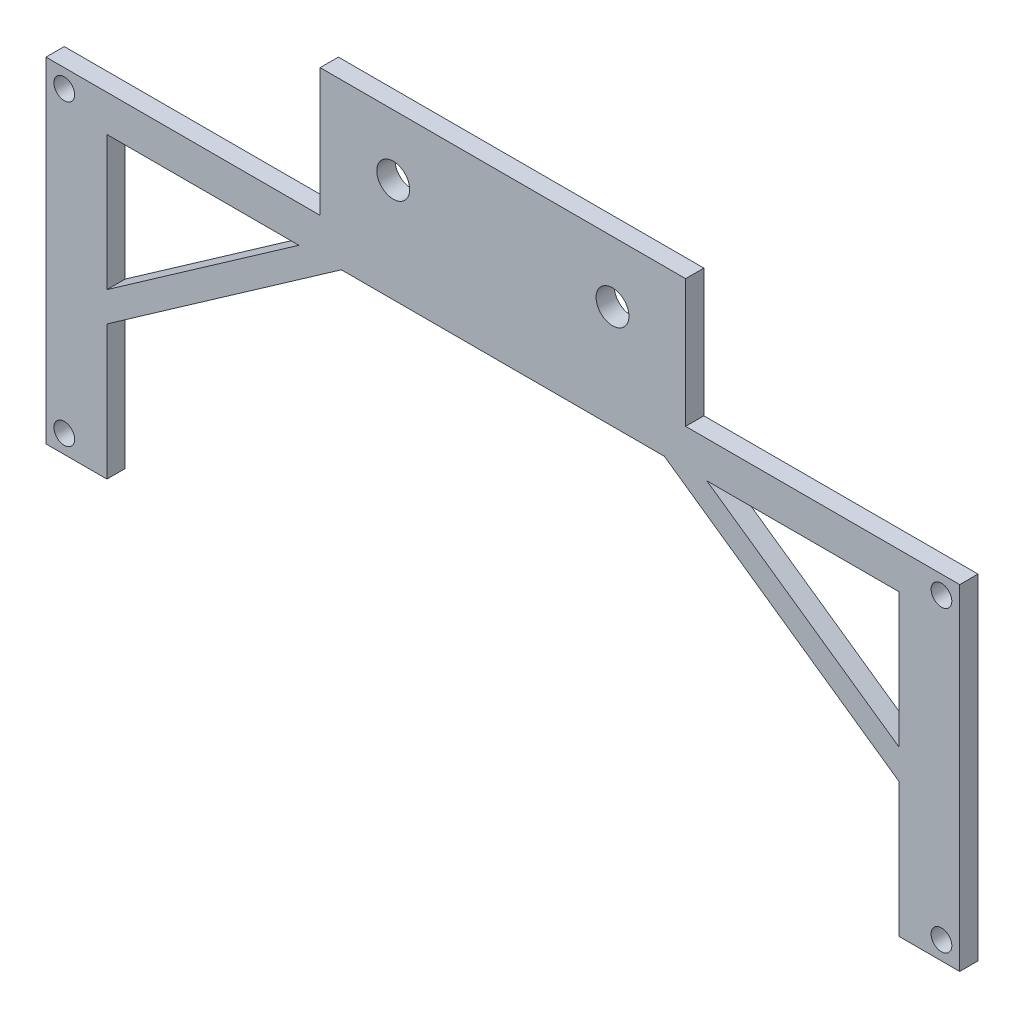
ISO-10303-21;
HEADER;
FILE_DESCRIPTION(('STEP AP214'),'2;1');
FILE_NAME('part.step','',(''),(''),'','','');
FILE_SCHEMA(('AUTOMOTIVE_DESIGN { 1 0 10303 214 1 1 1 1 }'));
ENDSEC;
DATA;
#1=APPLICATION_CONTEXT('core data for automotive mechanical design processes');
#2=APPLICATION_PROTOCOL_DEFINITION('international standard','automotive_design',2000,#1);
#3=PRODUCT_CONTEXT('',#1,'mechanical');
#4=PRODUCT('Part','Part','',(#3));
#5=PRODUCT_RELATED_PRODUCT_CATEGORY('part','',(#4));
#6=PRODUCT_DEFINITION_FORMATION('','',#4);
#7=PRODUCT_DEFINITION_CONTEXT('part definition',#1,'design');
#8=PRODUCT_DEFINITION('design','',#6,#7);
#9=PRODUCT_DEFINITION_SHAPE('','',#8);
#10=(LENGTH_UNIT() NAMED_UNIT(*) SI_UNIT(.MILLI.,.METRE.));
#11=(NAMED_UNIT(*) PLANE_ANGLE_UNIT() SI_UNIT($,.RADIAN.));
#12=(NAMED_UNIT(*) SI_UNIT($,.STERADIAN.) SOLID_ANGLE_UNIT());
#13=UNCERTAINTY_MEASURE_WITH_UNIT(LENGTH_MEASURE(1.E-05),#10,'distance_accuracy_value','');
#14=(GEOMETRIC_REPRESENTATION_CONTEXT(3) GLOBAL_UNCERTAINTY_ASSIGNED_CONTEXT((#13)) GLOBAL_UNIT_ASSIGNED_CONTEXT((#10,
#11,#12)) REPRESENTATION_CONTEXT('',''));
#15=CARTESIAN_POINT('',(0.,0.,0.));
#16=DIRECTION('',(0.,0.,1.));
#17=DIRECTION('',(1.,0.,0.));
#18=AXIS2_PLACEMENT_3D('',#15,#16,#17);
#19=CARTESIAN_POINT('',(-30.,-13.5,3.));
#20=DIRECTION('',(0.,1.,0.));
#21=DIRECTION('',(-1.,0.,0.));
#22=AXIS2_PLACEMENT_3D('',#19,#20,#21);
#23=PLANE('',#22);
#24=DIRECTION('',(1.,0.,0.));
#25=VECTOR('',#24,1.);
#26=CARTESIAN_POINT('',(-30.,-13.5,0.));
#27=LINE('',#26,#25);
#28=CARTESIAN_POINT('',(-26.5124126812189,-13.5,0.));
#29=VERTEX_POINT('',#28);
#30=CARTESIAN_POINT('',(26.5124126812189,-13.5,0.));
#31=VERTEX_POINT('',#30);
#32=EDGE_CURVE('E267',#29,#31,#27,.T.);
#33=ORIENTED_EDGE('',*,*,#32,.T.);
#34=DIRECTION('',(0.,0.,1.));
#35=VECTOR('',#34,1.);
#36=CARTESIAN_POINT('',(26.5124126812189,-13.5,-46.9800875122108));
#37=LINE('',#36,#35);
#38=CARTESIAN_POINT('',(26.5124126812189,-13.5,3.));
#39=VERTEX_POINT('',#38);
#40=EDGE_CURVE('E56',#31,#39,#37,.T.);
#41=ORIENTED_EDGE('',*,*,#40,.T.);
#42=DIRECTION('',(1.,0.,0.));
#43=VECTOR('',#42,1.);
#44=CARTESIAN_POINT('',(-30.,-13.5,3.));
#45=LINE('',#44,#43);
#46=CARTESIAN_POINT('',(-26.512412681219,-13.5,3.));
#47=VERTEX_POINT('',#46);
#48=EDGE_CURVE('E258',#47,#39,#45,.T.);
#49=ORIENTED_EDGE('',*,*,#48,.F.);
#50=DIRECTION('',(0.,0.,1.));
#51=VECTOR('',#50,1.);
#52=CARTESIAN_POINT('',(-26.5124126812189,-13.5,-46.9800875122108));
#53=LINE('',#52,#51);
#54=EDGE_CURVE('E467',#29,#47,#53,.T.);
#55=ORIENTED_EDGE('',*,*,#54,.F.);
#56=EDGE_LOOP('',(#33,#41,#49,#55));
#57=FACE_BOUND('',#56,.T.);
#58=ADVANCED_FACE('F33',(#57),#23,.F.);
#59=CARTESIAN_POINT('',(65.,-13.5,-159.765453086705));
#60=DIRECTION('',(-1.,0.,0.));
#61=DIRECTION('',(0.,-1.,0.));
#62=AXIS2_PLACEMENT_3D('',#59,#60,#61);
#63=PLANE('',#62);
#64=DIRECTION('',(0.,0.,1.));
#65=VECTOR('',#64,1.);
#66=CARTESIAN_POINT('',(65.,-40.4413111231467,-46.9800875122108));
#67=LINE('',#66,#65);
#68=CARTESIAN_POINT('',(65.,-40.4413111231467,0.));
#69=VERTEX_POINT('',#68);
#70=CARTESIAN_POINT('',(65.,-40.4413111231467,3.));
#71=VERTEX_POINT('',#70);
#72=EDGE_CURVE('E445',#69,#71,#67,.T.);
#73=ORIENTED_EDGE('',*,*,#72,.F.);
#74=DIRECTION('',(0.,1.,0.));
#75=VECTOR('',#74,1.);
#76=CARTESIAN_POINT('',(65.,-13.5,0.));
#77=LINE('',#76,#75);
#78=CARTESIAN_POINT('',(65.,-62.4999999999999,0.));
#79=VERTEX_POINT('',#78);
#80=EDGE_CURVE('E317',#79,#69,#77,.T.);
#81=ORIENTED_EDGE('',*,*,#80,.F.);
#82=DIRECTION('',(0.,0.,1.));
#83=VECTOR('',#82,1.);
#84=CARTESIAN_POINT('',(65.,-62.4999999999999,-159.765453086705));
#85=LINE('',#84,#83);
#86=CARTESIAN_POINT('',(65.,-62.4999999999999,3.));
#87=VERTEX_POINT('',#86);
#88=EDGE_CURVE('E206',#79,#87,#85,.T.);
#89=ORIENTED_EDGE('',*,*,#88,.T.);
#90=DIRECTION('',(0.,-1.,0.));
#91=VECTOR('',#90,1.);
#92=CARTESIAN_POINT('',(65.,-13.5,3.));
#93=LINE('',#92,#91);
#94=EDGE_CURVE('E193',#71,#87,#93,.T.);
#95=ORIENTED_EDGE('',*,*,#94,.F.);
#96=EDGE_LOOP('',(#73,#81,#89,#95));
#97=FACE_BOUND('',#96,.T.);
#98=ADVANCED_FACE('F365',(#97),#63,.T.);
#99=CARTESIAN_POINT('',(-65.,-13.5,0.));
#100=VERTEX_POINT('',#99);
#101=CARTESIAN_POINT('',(-33.4875873187811,-13.5,0.));
#102=VERTEX_POINT('',#101);
#103=EDGE_CURVE('E264',#100,#102,#27,.T.);
#104=ORIENTED_EDGE('',*,*,#103,.T.);
#105=DIRECTION('',(0.,0.,1.));
#106=VECTOR('',#105,1.);
#107=CARTESIAN_POINT('',(-33.4875873187811,-13.5,-46.9800875122108));
#108=LINE('',#107,#106);
#109=CARTESIAN_POINT('',(-33.4875873187811,-13.5,3.));
#110=VERTEX_POINT('',#109);
#111=EDGE_CURVE('E465',#102,#110,#108,.T.);
#112=ORIENTED_EDGE('',*,*,#111,.T.);
#113=CARTESIAN_POINT('',(-65.,-13.5,3.));
#114=VERTEX_POINT('',#113);
#115=EDGE_CURVE('E254',#114,#110,#45,.T.);
#116=ORIENTED_EDGE('',*,*,#115,.F.);
#117=DIRECTION('',(0.,0.,1.));
#118=VECTOR('',#117,1.);
#119=CARTESIAN_POINT('',(-65.,-13.5,-159.765453086705));
#120=LINE('',#119,#118);
#121=EDGE_CURVE('E211',#100,#114,#120,.T.);
#122=ORIENTED_EDGE('',*,*,#121,.F.);
#123=EDGE_LOOP('',(#104,#112,#116,#122));
#124=FACE_BOUND('',#123,.T.);
#125=ADVANCED_FACE('F366',(#124),#23,.F.);
#126=CARTESIAN_POINT('',(-65.,-13.5,-159.765453086705));
#127=DIRECTION('',(1.,0.,0.));
#128=DIRECTION('',(0.,0.,-1.));
#129=AXIS2_PLACEMENT_3D('',#126,#127,#128);
#130=PLANE('',#129);
#131=DIRECTION('',(0.,0.,1.));
#132=VECTOR('',#131,1.);
#133=CARTESIAN_POINT('',(-65.,-35.5586888768532,-46.9800875122108));
#134=LINE('',#133,#132);
#135=CARTESIAN_POINT('',(-65.,-35.5586888768532,0.));
#136=VERTEX_POINT('',#135);
#137=CARTESIAN_POINT('',(-65.,-35.5586888768532,3.));
#138=VERTEX_POINT('',#137);
#139=EDGE_CURVE('E456',#136,#138,#134,.T.);
#140=ORIENTED_EDGE('',*,*,#139,.F.);
#141=DIRECTION('',(0.,-1.,0.));
#142=VECTOR('',#141,1.);
#143=CARTESIAN_POINT('',(-65.,-13.5,0.));
#144=LINE('',#143,#142);
#145=EDGE_CURVE('E334',#100,#136,#144,.T.);
#146=ORIENTED_EDGE('',*,*,#145,.F.);
#147=ORIENTED_EDGE('',*,*,#121,.T.);
#148=DIRECTION('',(0.,1.,0.));
#149=VECTOR('',#148,1.);
#150=CARTESIAN_POINT('',(-65.,-13.5,3.));
#151=LINE('',#150,#149);
#152=EDGE_CURVE('E321',#138,#114,#151,.T.);
#153=ORIENTED_EDGE('',*,*,#152,.F.);
#154=EDGE_LOOP('',(#140,#146,#147,#153));
#155=FACE_BOUND('',#154,.T.);
#156=ADVANCED_FACE('F362',(#155),#130,.T.);
#157=CARTESIAN_POINT('',(-30.,13.5,3.));
#158=DIRECTION('',(1.,0.,0.));
#159=DIRECTION('',(0.,0.,-1.));
#160=AXIS2_PLACEMENT_3D('',#157,#158,#159);
#161=PLANE('',#160);
#162=DIRECTION('',(0.,-1.,0.));
#163=VECTOR('',#162,1.);
#164=CARTESIAN_POINT('',(-30.,13.5,0.));
#165=LINE('',#164,#163);
#166=CARTESIAN_POINT('',(-30.,13.5,0.));
#167=VERTEX_POINT('',#166);
#168=CARTESIAN_POINT('',(-30.,-7.49999999999997,0.));
#169=VERTEX_POINT('',#168);
#170=EDGE_CURVE('E249',#167,#169,#165,.T.);
#171=ORIENTED_EDGE('',*,*,#170,.T.);
#172=DIRECTION('',(0.,0.,1.));
#173=VECTOR('',#172,1.);
#174=CARTESIAN_POINT('',(-30.,-7.49999999999996,3.));
#175=LINE('',#174,#173);
#176=CARTESIAN_POINT('',(-30.,-7.49999999999997,3.));
#177=VERTEX_POINT('',#176);
#178=EDGE_CURVE('E247',#169,#177,#175,.T.);
#179=ORIENTED_EDGE('',*,*,#178,.T.);
#180=DIRECTION('',(0.,-1.,0.));
#181=VECTOR('',#180,1.);
#182=CARTESIAN_POINT('',(-30.,13.5,3.));
#183=LINE('',#182,#181);
#184=CARTESIAN_POINT('',(-30.,13.5,3.));
#185=VERTEX_POINT('',#184);
#186=EDGE_CURVE('E250',#185,#177,#183,.T.);
#187=ORIENTED_EDGE('',*,*,#186,.F.);
#188=DIRECTION('',(0.,0.,-1.));
#189=VECTOR('',#188,1.);
#190=CARTESIAN_POINT('',(-30.,13.5,3.));
#191=LINE('',#190,#189);
#192=EDGE_CURVE('E41',#185,#167,#191,.T.);
#193=ORIENTED_EDGE('',*,*,#192,.T.);
#194=EDGE_LOOP('',(#171,#179,#187,#193));
#195=FACE_BOUND('',#194,.T.);
#196=ADVANCED_FACE('F35',(#195),#161,.F.);
#197=CARTESIAN_POINT('',(33.487587318781,-13.5,3.));
#198=VERTEX_POINT('',#197);
#199=CARTESIAN_POINT('',(65.,-13.5,3.));
#200=VERTEX_POINT('',#199);
#201=EDGE_CURVE('E48',#198,#200,#45,.T.);
#202=ORIENTED_EDGE('',*,*,#201,.F.);
#203=DIRECTION('',(0.,0.,1.));
#204=VECTOR('',#203,1.);
#205=CARTESIAN_POINT('',(33.4875873187811,-13.5,-46.9800875122108));
#206=LINE('',#205,#204);
#207=CARTESIAN_POINT('',(33.4875873187811,-13.5,0.));
#208=VERTEX_POINT('',#207);
#209=EDGE_CURVE('E176',#208,#198,#206,.T.);
#210=ORIENTED_EDGE('',*,*,#209,.F.);
#211=CARTESIAN_POINT('',(65.,-13.5,0.));
#212=VERTEX_POINT('',#211);
#213=EDGE_CURVE('E263',#208,#212,#27,.T.);
#214=ORIENTED_EDGE('',*,*,#213,.T.);
#215=DIRECTION('',(0.,0.,1.));
#216=VECTOR('',#215,1.);
#217=CARTESIAN_POINT('',(65.,-13.5,-159.765453086705));
#218=LINE('',#217,#216);
#219=EDGE_CURVE('E209',#212,#200,#218,.T.);
#220=ORIENTED_EDGE('',*,*,#219,.T.);
#221=EDGE_LOOP('',(#202,#210,#214,#220));
#222=FACE_BOUND('',#221,.T.);
#223=ADVANCED_FACE('F367',(#222),#23,.F.);
#224=CARTESIAN_POINT('',(30.,13.5,3.));
#225=DIRECTION('',(-1.,0.,0.));
#226=DIRECTION('',(0.,0.,1.));
#227=AXIS2_PLACEMENT_3D('',#224,#225,#226);
#228=PLANE('',#227);
#229=DIRECTION('',(0.,1.,0.));
#230=VECTOR('',#229,1.);
#231=CARTESIAN_POINT('',(30.,13.5,3.));
#232=LINE('',#231,#230);
#233=CARTESIAN_POINT('',(30.,-7.49999999999997,3.));
#234=VERTEX_POINT('',#233);
#235=CARTESIAN_POINT('',(30.,13.5,3.));
#236=VERTEX_POINT('',#235);
#237=EDGE_CURVE('E257',#234,#236,#232,.T.);
#238=ORIENTED_EDGE('',*,*,#237,.F.);
#239=DIRECTION('',(0.,0.,-1.));
#240=VECTOR('',#239,1.);
#241=CARTESIAN_POINT('',(30.,-7.49999999999998,3.));
#242=LINE('',#241,#240);
#243=CARTESIAN_POINT('',(30.,-7.49999999999998,0.));
#244=VERTEX_POINT('',#243);
#245=EDGE_CURVE('E232',#234,#244,#242,.T.);
#246=ORIENTED_EDGE('',*,*,#245,.T.);
#247=DIRECTION('',(0.,1.,0.));
#248=VECTOR('',#247,1.);
#249=CARTESIAN_POINT('',(30.,13.5,0.));
#250=LINE('',#249,#248);
#251=CARTESIAN_POINT('',(30.,13.5,0.));
#252=VERTEX_POINT('',#251);
#253=EDGE_CURVE('E266',#244,#252,#250,.T.);
#254=ORIENTED_EDGE('',*,*,#253,.T.);
#255=DIRECTION('',(0.,0.,-1.));
#256=VECTOR('',#255,1.);
#257=CARTESIAN_POINT('',(30.,13.5,3.));
#258=LINE('',#257,#256);
#259=EDGE_CURVE('E11',#236,#252,#258,.T.);
#260=ORIENTED_EDGE('',*,*,#259,.F.);
#261=EDGE_LOOP('',(#238,#246,#254,#260));
#262=FACE_BOUND('',#261,.T.);
#263=ADVANCED_FACE('F299',(#262),#228,.F.);
#264=CARTESIAN_POINT('',(-30.,13.5,3.));
#265=DIRECTION('',(0.,-1.,0.));
#266=DIRECTION('',(0.,0.,-1.));
#267=AXIS2_PLACEMENT_3D('',#264,#265,#266);
#268=PLANE('',#267);
#269=DIRECTION('',(-1.,0.,0.));
#270=VECTOR('',#269,1.);
#271=CARTESIAN_POINT('',(-30.,13.5,0.));
#272=LINE('',#271,#270);
#273=EDGE_CURVE('E253',#252,#167,#272,.T.);
#274=ORIENTED_EDGE('',*,*,#273,.T.);
#275=ORIENTED_EDGE('',*,*,#192,.F.);
#276=DIRECTION('',(-1.,0.,0.));
#277=VECTOR('',#276,1.);
#278=CARTESIAN_POINT('',(-30.,13.5,3.));
#279=LINE('',#278,#277);
#280=EDGE_CURVE('E260',#236,#185,#279,.T.);
#281=ORIENTED_EDGE('',*,*,#280,.F.);
#282=ORIENTED_EDGE('',*,*,#259,.T.);
#283=EDGE_LOOP('',(#274,#275,#281,#282));
#284=FACE_BOUND('',#283,.T.);
#285=ADVANCED_FACE('F297',(#284),#268,.F.);
#286=CARTESIAN_POINT('',(0.,0.,3.));
#287=DIRECTION('',(0.,0.,1.));
#288=DIRECTION('',(1.,0.,0.));
#289=AXIS2_PLACEMENT_3D('',#286,#287,#288);
#290=PLANE('',#289);
#291=CARTESIAN_POINT('',(18.,3.49999999999998,3.));
#292=DIRECTION('',(0.,0.,1.));
#293=DIRECTION('',(-1.,0.,0.));
#294=AXIS2_PLACEMENT_3D('',#291,#292,#293);
#295=CIRCLE('',#294,2.7);
#296=CARTESIAN_POINT('',(15.3,3.49999999999998,3.));
#297=VERTEX_POINT('',#296);
#298=EDGE_CURVE('E432',#297,#297,#295,.T.);
#299=ORIENTED_EDGE('',*,*,#298,.F.);
#300=EDGE_LOOP('',(#299));
#301=FACE_BOUND('',#300,.T.);
#302=CARTESIAN_POINT('',(-18.,3.5,3.));
#303=DIRECTION('',(0.,0.,1.));
#304=DIRECTION('',(1.,0.,0.));
#305=AXIS2_PLACEMENT_3D('',#302,#303,#304);
#306=CIRCLE('',#305,2.7);
#307=CARTESIAN_POINT('',(-15.3,3.5,3.));
#308=VERTEX_POINT('',#307);
#309=EDGE_CURVE('E435',#308,#308,#306,.T.);
#310=ORIENTED_EDGE('',*,*,#309,.F.);
#311=EDGE_LOOP('',(#310));
#312=FACE_BOUND('',#311,.T.);
#313=ORIENTED_EDGE('',*,*,#48,.T.);
#314=DIRECTION('',(0.81923192051904,-0.573462344363329,0.));
#315=VECTOR('',#314,1.);
#316=CARTESIAN_POINT('',(63.8530753112734,-39.6384638410381,3.));
#317=LINE('',#316,#315);
#318=EDGE_CURVE('E179',#39,#71,#317,.T.);
#319=ORIENTED_EDGE('',*,*,#318,.T.);
#320=ORIENTED_EDGE('',*,*,#94,.T.);
#321=DIRECTION('',(1.,0.,0.));
#322=VECTOR('',#321,1.);
#323=CARTESIAN_POINT('',(65.,-62.4999999999999,3.));
#324=LINE('',#323,#322);
#325=CARTESIAN_POINT('',(75.,-62.4999999999999,3.));
#326=VERTEX_POINT('',#325);
#327=EDGE_CURVE('E192',#87,#326,#324,.T.);
#328=ORIENTED_EDGE('',*,*,#327,.T.);
#329=DIRECTION('',(0.,1.,0.));
#330=VECTOR('',#329,1.);
#331=CARTESIAN_POINT('',(75.,-7.5,3.));
#332=LINE('',#331,#330);
#333=CARTESIAN_POINT('',(75.,-7.5,3.));
#334=VERTEX_POINT('',#333);
#335=EDGE_CURVE('E234',#326,#334,#332,.T.);
#336=ORIENTED_EDGE('',*,*,#335,.T.);
#337=DIRECTION('',(-1.,0.,0.));
#338=VECTOR('',#337,1.);
#339=CARTESIAN_POINT('',(-75.,-7.49999999999995,3.));
#340=LINE('',#339,#338);
#341=EDGE_CURVE('E238',#334,#234,#340,.T.);
#342=ORIENTED_EDGE('',*,*,#341,.T.);
#343=ORIENTED_EDGE('',*,*,#237,.T.);
#344=ORIENTED_EDGE('',*,*,#280,.T.);
#345=ORIENTED_EDGE('',*,*,#186,.T.);
#346=CARTESIAN_POINT('',(-75.,-7.49999999999995,3.));
#347=VERTEX_POINT('',#346);
#348=EDGE_CURVE('E237',#177,#347,#340,.T.);
#349=ORIENTED_EDGE('',*,*,#348,.T.);
#350=DIRECTION('',(0.,-1.,0.));
#351=VECTOR('',#350,1.);
#352=CARTESIAN_POINT('',(-75.,-7.49999999999995,3.));
#353=LINE('',#352,#351);
#354=CARTESIAN_POINT('',(-75.,-62.4999999999999,3.));
#355=VERTEX_POINT('',#354);
#356=EDGE_CURVE('E221',#347,#355,#353,.T.);
#357=ORIENTED_EDGE('',*,*,#356,.T.);
#358=DIRECTION('',(1.,0.,0.));
#359=VECTOR('',#358,1.);
#360=CARTESIAN_POINT('',(-75.,-62.4999999999999,3.));
#361=LINE('',#360,#359);
#362=CARTESIAN_POINT('',(-65.,-62.4999999999999,3.));
#363=VERTEX_POINT('',#362);
#364=EDGE_CURVE('E295',#355,#363,#361,.T.);
#365=ORIENTED_EDGE('',*,*,#364,.T.);
#366=CARTESIAN_POINT('',(-65.,-40.4413111231467,3.));
#367=VERTEX_POINT('',#366);
#368=EDGE_CURVE('E198',#363,#367,#151,.T.);
#369=ORIENTED_EDGE('',*,*,#368,.T.);
#370=DIRECTION('',(0.819231920519041,0.573462344363328,0.));
#371=VECTOR('',#370,1.);
#372=CARTESIAN_POINT('',(-28.8530753112733,-15.1384638410381,3.));
#373=LINE('',#372,#371);
#374=EDGE_CURVE('E447',#367,#47,#373,.T.);
#375=ORIENTED_EDGE('',*,*,#374,.T.);
#376=EDGE_LOOP('',(#313,#319,#320,#328,#336,#342,#343,#344,#345,#349,#357,#365,#369,#375));
#377=FACE_BOUND('',#376,.T.);
#378=ORIENTED_EDGE('',*,*,#115,.T.);
#379=DIRECTION('',(-0.819231920519041,-0.573462344363328,0.));
#380=VECTOR('',#379,1.);
#381=CARTESIAN_POINT('',(-65.,-35.5586888768532,3.));
#382=LINE('',#381,#380);
#383=EDGE_CURVE('E460',#110,#138,#382,.T.);
#384=ORIENTED_EDGE('',*,*,#383,.T.);
#385=ORIENTED_EDGE('',*,*,#152,.T.);
#386=EDGE_LOOP('',(#378,#384,#385));
#387=FACE_BOUND('',#386,.T.);
#388=CARTESIAN_POINT('',(-72.,-59.4999999999999,3.));
#389=DIRECTION('',(0.,0.,1.));
#390=DIRECTION('',(-1.,0.,0.));
#391=AXIS2_PLACEMENT_3D('',#388,#389,#390);
#392=CIRCLE('',#391,1.7);
#393=CARTESIAN_POINT('',(-73.7,-59.4999999999999,3.));
#394=VERTEX_POINT('',#393);
#395=EDGE_CURVE('E473',#394,#394,#392,.T.);
#396=ORIENTED_EDGE('',*,*,#395,.F.);
#397=EDGE_LOOP('',(#396));
#398=FACE_BOUND('',#397,.T.);
#399=CARTESIAN_POINT('',(72.,-59.4999999999999,3.));
#400=DIRECTION('',(0.,0.,1.));
#401=DIRECTION('',(1.,0.,0.));
#402=AXIS2_PLACEMENT_3D('',#399,#400,#401);
#403=CIRCLE('',#402,1.7);
#404=CARTESIAN_POINT('',(73.7,-59.4999999999999,3.));
#405=VERTEX_POINT('',#404);
#406=EDGE_CURVE('E479',#405,#405,#403,.T.);
#407=ORIENTED_EDGE('',*,*,#406,.F.);
#408=EDGE_LOOP('',(#407));
#409=FACE_BOUND('',#408,.T.);
#410=CARTESIAN_POINT('',(72.,-10.5,3.));
#411=DIRECTION('',(0.,0.,1.));
#412=DIRECTION('',(-1.,0.,0.));
#413=AXIS2_PLACEMENT_3D('',#410,#411,#412);
#414=CIRCLE('',#413,1.7);
#415=CARTESIAN_POINT('',(70.3,-10.5,3.));
#416=VERTEX_POINT('',#415);
#417=EDGE_CURVE('E332',#416,#416,#414,.T.);
#418=ORIENTED_EDGE('',*,*,#417,.F.);
#419=EDGE_LOOP('',(#418));
#420=FACE_BOUND('',#419,.T.);
#421=CARTESIAN_POINT('',(-72.,-10.5,3.));
#422=DIRECTION('',(0.,0.,1.));
#423=DIRECTION('',(1.,0.,0.));
#424=AXIS2_PLACEMENT_3D('',#421,#422,#423);
#425=CIRCLE('',#424,1.7);
#426=CARTESIAN_POINT('',(-70.3,-10.5,3.));
#427=VERTEX_POINT('',#426);
#428=EDGE_CURVE('E324',#427,#427,#425,.T.);
#429=ORIENTED_EDGE('',*,*,#428,.F.);
#430=EDGE_LOOP('',(#429));
#431=FACE_BOUND('',#430,.T.);
#432=DIRECTION('',(-0.819231920519041,0.573462344363328,0.));
#433=VECTOR('',#432,1.);
#434=CARTESIAN_POINT('',(65.,-35.5586888768533,3.));
#435=LINE('',#434,#433);
#436=CARTESIAN_POINT('',(65.,-35.5586888768533,3.));
#437=VERTEX_POINT('',#436);
#438=EDGE_CURVE('E170',#437,#198,#435,.T.);
#439=ORIENTED_EDGE('',*,*,#438,.T.);
#440=ORIENTED_EDGE('',*,*,#201,.T.);
#441=EDGE_CURVE('E187',#200,#437,#93,.T.);
#442=ORIENTED_EDGE('',*,*,#441,.T.);
#443=EDGE_LOOP('',(#439,#440,#442));
#444=FACE_BOUND('',#443,.T.);
#445=ADVANCED_FACE('F191',(#301,#312,#377,#387,#398,#409,#420,#431,#444),#290,.T.);
#446=CARTESIAN_POINT('',(0.,0.,0.));
#447=DIRECTION('',(0.,0.,1.));
#448=DIRECTION('',(1.,0.,0.));
#449=AXIS2_PLACEMENT_3D('',#446,#447,#448);
#450=PLANE('',#449);
#451=CARTESIAN_POINT('',(18.,3.49999999999998,0.));
#452=DIRECTION('',(0.,0.,1.));
#453=DIRECTION('',(-1.,0.,0.));
#454=AXIS2_PLACEMENT_3D('',#451,#452,#453);
#455=CIRCLE('',#454,2.7);
#456=CARTESIAN_POINT('',(15.3,3.49999999999998,0.));
#457=VERTEX_POINT('',#456);
#458=EDGE_CURVE('E429',#457,#457,#455,.T.);
#459=ORIENTED_EDGE('',*,*,#458,.T.);
#460=EDGE_LOOP('',(#459));
#461=FACE_BOUND('',#460,.T.);
#462=CARTESIAN_POINT('',(-18.,3.5,0.));
#463=DIRECTION('',(0.,0.,1.));
#464=DIRECTION('',(1.,0.,0.));
#465=AXIS2_PLACEMENT_3D('',#462,#463,#464);
#466=CIRCLE('',#465,2.7);
#467=CARTESIAN_POINT('',(-15.3,3.5,0.));
#468=VERTEX_POINT('',#467);
#469=EDGE_CURVE('E180',#468,#468,#466,.T.);
#470=ORIENTED_EDGE('',*,*,#469,.T.);
#471=EDGE_LOOP('',(#470));
#472=FACE_BOUND('',#471,.T.);
#473=ORIENTED_EDGE('',*,*,#213,.F.);
#474=DIRECTION('',(0.81923192051904,-0.573462344363328,0.));
#475=VECTOR('',#474,1.);
#476=CARTESIAN_POINT('',(65.,-35.5586888768533,0.));
#477=LINE('',#476,#475);
#478=CARTESIAN_POINT('',(65.,-35.5586888768533,0.));
#479=VERTEX_POINT('',#478);
#480=EDGE_CURVE('E442',#208,#479,#477,.T.);
#481=ORIENTED_EDGE('',*,*,#480,.T.);
#482=EDGE_CURVE('E189',#479,#212,#77,.T.);
#483=ORIENTED_EDGE('',*,*,#482,.T.);
#484=EDGE_LOOP('',(#473,#481,#483));
#485=FACE_BOUND('',#484,.T.);
#486=ORIENTED_EDGE('',*,*,#32,.F.);
#487=DIRECTION('',(-0.819231920519041,-0.573462344363328,0.));
#488=VECTOR('',#487,1.);
#489=CARTESIAN_POINT('',(-28.8530753112733,-15.1384638410381,0.));
#490=LINE('',#489,#488);
#491=CARTESIAN_POINT('',(-65.,-40.4413111231467,0.));
#492=VERTEX_POINT('',#491);
#493=EDGE_CURVE('E344',#29,#492,#490,.T.);
#494=ORIENTED_EDGE('',*,*,#493,.T.);
#495=CARTESIAN_POINT('',(-65.,-62.4999999999999,0.));
#496=VERTEX_POINT('',#495);
#497=EDGE_CURVE('E205',#492,#496,#144,.T.);
#498=ORIENTED_EDGE('',*,*,#497,.T.);
#499=DIRECTION('',(-1.,0.,0.));
#500=VECTOR('',#499,1.);
#501=CARTESIAN_POINT('',(-75.,-62.4999999999999,0.));
#502=LINE('',#501,#500);
#503=CARTESIAN_POINT('',(-75.,-62.4999999999999,0.));
#504=VERTEX_POINT('',#503);
#505=EDGE_CURVE('E218',#496,#504,#502,.T.);
#506=ORIENTED_EDGE('',*,*,#505,.T.);
#507=DIRECTION('',(0.,1.,0.));
#508=VECTOR('',#507,1.);
#509=CARTESIAN_POINT('',(-75.,-7.49999999999995,0.));
#510=LINE('',#509,#508);
#511=CARTESIAN_POINT('',(-75.,-7.49999999999995,0.));
#512=VERTEX_POINT('',#511);
#513=EDGE_CURVE('E230',#504,#512,#510,.T.);
#514=ORIENTED_EDGE('',*,*,#513,.T.);
#515=DIRECTION('',(1.,0.,0.));
#516=VECTOR('',#515,1.);
#517=CARTESIAN_POINT('',(-75.,-7.49999999999995,0.));
#518=LINE('',#517,#516);
#519=EDGE_CURVE('E227',#512,#169,#518,.T.);
#520=ORIENTED_EDGE('',*,*,#519,.T.);
#521=ORIENTED_EDGE('',*,*,#170,.F.);
#522=ORIENTED_EDGE('',*,*,#273,.F.);
#523=ORIENTED_EDGE('',*,*,#253,.F.);
#524=CARTESIAN_POINT('',(75.,-7.5,0.));
#525=VERTEX_POINT('',#524);
#526=EDGE_CURVE('E225',#244,#525,#518,.T.);
#527=ORIENTED_EDGE('',*,*,#526,.T.);
#528=DIRECTION('',(0.,-1.,0.));
#529=VECTOR('',#528,1.);
#530=CARTESIAN_POINT('',(75.,-7.5,0.));
#531=LINE('',#530,#529);
#532=CARTESIAN_POINT('',(75.,-62.4999999999999,0.));
#533=VERTEX_POINT('',#532);
#534=EDGE_CURVE('E223',#525,#533,#531,.T.);
#535=ORIENTED_EDGE('',*,*,#534,.T.);
#536=DIRECTION('',(-1.,0.,0.));
#537=VECTOR('',#536,1.);
#538=CARTESIAN_POINT('',(65.,-62.4999999999999,0.));
#539=LINE('',#538,#537);
#540=EDGE_CURVE('E222',#533,#79,#539,.T.);
#541=ORIENTED_EDGE('',*,*,#540,.T.);
#542=ORIENTED_EDGE('',*,*,#80,.T.);
#543=DIRECTION('',(-0.81923192051904,0.573462344363329,0.));
#544=VECTOR('',#543,1.);
#545=CARTESIAN_POINT('',(63.8530753112734,-39.6384638410381,0.));
#546=LINE('',#545,#544);
#547=EDGE_CURVE('E444',#69,#31,#546,.T.);
#548=ORIENTED_EDGE('',*,*,#547,.T.);
#549=EDGE_LOOP('',(#486,#494,#498,#506,#514,#520,#521,#522,#523,#527,#535,#541,#542,#548));
#550=FACE_BOUND('',#549,.T.);
#551=CARTESIAN_POINT('',(-72.,-59.4999999999999,0.));
#552=DIRECTION('',(0.,0.,1.));
#553=DIRECTION('',(-1.,0.,0.));
#554=AXIS2_PLACEMENT_3D('',#551,#552,#553);
#555=CIRCLE('',#554,1.7);
#556=CARTESIAN_POINT('',(-73.7,-59.4999999999999,0.));
#557=VERTEX_POINT('',#556);
#558=EDGE_CURVE('E329',#557,#557,#555,.T.);
#559=ORIENTED_EDGE('',*,*,#558,.T.);
#560=EDGE_LOOP('',(#559));
#561=FACE_BOUND('',#560,.T.);
#562=CARTESIAN_POINT('',(72.,-59.4999999999999,0.));
#563=DIRECTION('',(0.,0.,1.));
#564=DIRECTION('',(1.,0.,0.));
#565=AXIS2_PLACEMENT_3D('',#562,#563,#564);
#566=CIRCLE('',#565,1.7);
#567=CARTESIAN_POINT('',(73.7,-59.4999999999999,0.));
#568=VERTEX_POINT('',#567);
#569=EDGE_CURVE('E476',#568,#568,#566,.T.);
#570=ORIENTED_EDGE('',*,*,#569,.T.);
#571=EDGE_LOOP('',(#570));
#572=FACE_BOUND('',#571,.T.);
#573=CARTESIAN_POINT('',(72.,-10.5,0.));
#574=DIRECTION('',(0.,0.,1.));
#575=DIRECTION('',(-1.,0.,0.));
#576=AXIS2_PLACEMENT_3D('',#573,#574,#575);
#577=CIRCLE('',#576,1.7);
#578=CARTESIAN_POINT('',(70.3,-10.5,0.));
#579=VERTEX_POINT('',#578);
#580=EDGE_CURVE('E481',#579,#579,#577,.T.);
#581=ORIENTED_EDGE('',*,*,#580,.T.);
#582=EDGE_LOOP('',(#581));
#583=FACE_BOUND('',#582,.T.);
#584=CARTESIAN_POINT('',(-72.,-10.5,0.));
#585=DIRECTION('',(0.,0.,1.));
#586=DIRECTION('',(1.,0.,0.));
#587=AXIS2_PLACEMENT_3D('',#584,#585,#586);
#588=CIRCLE('',#587,1.7);
#589=CARTESIAN_POINT('',(-70.3,-10.5,0.));
#590=VERTEX_POINT('',#589);
#591=EDGE_CURVE('E322',#590,#590,#588,.T.);
#592=ORIENTED_EDGE('',*,*,#591,.T.);
#593=EDGE_LOOP('',(#592));
#594=FACE_BOUND('',#593,.T.);
#595=DIRECTION('',(0.819231920519041,0.573462344363328,0.));
#596=VECTOR('',#595,1.);
#597=CARTESIAN_POINT('',(-65.,-35.5586888768532,0.));
#598=LINE('',#597,#596);
#599=EDGE_CURVE('E455',#136,#102,#598,.T.);
#600=ORIENTED_EDGE('',*,*,#599,.T.);
#601=ORIENTED_EDGE('',*,*,#103,.F.);
#602=ORIENTED_EDGE('',*,*,#145,.T.);
#603=EDGE_LOOP('',(#600,#601,#602));
#604=FACE_BOUND('',#603,.T.);
#605=ADVANCED_FACE('F279',(#461,#472,#485,#550,#561,#572,#583,#594,#604),#450,.F.);
#606=CARTESIAN_POINT('',(75.,-7.5,-150.119952038362));
#607=DIRECTION('',(1.,0.,0.));
#608=DIRECTION('',(0.,0.,-1.));
#609=AXIS2_PLACEMENT_3D('',#606,#607,#608);
#610=PLANE('',#609);
#611=ORIENTED_EDGE('',*,*,#534,.F.);
#612=DIRECTION('',(0.,0.,1.));
#613=VECTOR('',#612,1.);
#614=CARTESIAN_POINT('',(75.,-7.5,-150.119952038362));
#615=LINE('',#614,#613);
#616=EDGE_CURVE('E241',#525,#334,#615,.T.);
#617=ORIENTED_EDGE('',*,*,#616,.T.);
#618=ORIENTED_EDGE('',*,*,#335,.F.);
#619=DIRECTION('',(0.,0.,1.));
#620=VECTOR('',#619,1.);
#621=CARTESIAN_POINT('',(75.,-62.4999999999999,-159.765453086705));
#622=LINE('',#621,#620);
#623=EDGE_CURVE('E202',#533,#326,#622,.T.);
#624=ORIENTED_EDGE('',*,*,#623,.F.);
#625=EDGE_LOOP('',(#611,#617,#618,#624));
#626=FACE_BOUND('',#625,.T.);
#627=ADVANCED_FACE('F308',(#626),#610,.T.);
#628=CARTESIAN_POINT('',(-75.,-7.49999999999995,-150.119952038362));
#629=DIRECTION('',(0.,1.,0.));
#630=DIRECTION('',(-1.,0.,0.));
#631=AXIS2_PLACEMENT_3D('',#628,#629,#630);
#632=PLANE('',#631);
#633=ORIENTED_EDGE('',*,*,#245,.F.);
#634=ORIENTED_EDGE('',*,*,#341,.F.);
#635=ORIENTED_EDGE('',*,*,#616,.F.);
#636=ORIENTED_EDGE('',*,*,#526,.F.);
#637=EDGE_LOOP('',(#633,#634,#635,#636));
#638=FACE_BOUND('',#637,.T.);
#639=ADVANCED_FACE('F310',(#638),#632,.T.);
#640=ORIENTED_EDGE('',*,*,#178,.F.);
#641=ORIENTED_EDGE('',*,*,#519,.F.);
#642=DIRECTION('',(0.,0.,1.));
#643=VECTOR('',#642,1.);
#644=CARTESIAN_POINT('',(-75.,-7.49999999999995,-150.119952038362));
#645=LINE('',#644,#643);
#646=EDGE_CURVE('E226',#512,#347,#645,.T.);
#647=ORIENTED_EDGE('',*,*,#646,.T.);
#648=ORIENTED_EDGE('',*,*,#348,.F.);
#649=EDGE_LOOP('',(#640,#641,#647,#648));
#650=FACE_BOUND('',#649,.T.);
#651=ADVANCED_FACE('F284',(#650),#632,.T.);
#652=CARTESIAN_POINT('',(-75.,-7.49999999999995,-150.119952038362));
#653=DIRECTION('',(-1.,0.,0.));
#654=DIRECTION('',(0.,0.,1.));
#655=AXIS2_PLACEMENT_3D('',#652,#653,#654);
#656=PLANE('',#655);
#657=ORIENTED_EDGE('',*,*,#513,.F.);
#658=DIRECTION('',(0.,0.,1.));
#659=VECTOR('',#658,1.);
#660=CARTESIAN_POINT('',(-75.,-62.4999999999999,-159.765453086705));
#661=LINE('',#660,#659);
#662=EDGE_CURVE('E196',#504,#355,#661,.T.);
#663=ORIENTED_EDGE('',*,*,#662,.T.);
#664=ORIENTED_EDGE('',*,*,#356,.F.);
#665=ORIENTED_EDGE('',*,*,#646,.F.);
#666=EDGE_LOOP('',(#657,#663,#664,#665));
#667=FACE_BOUND('',#666,.T.);
#668=ADVANCED_FACE('F288',(#667),#656,.T.);
#669=CARTESIAN_POINT('',(65.,-62.4999999999999,-159.765453086705));
#670=DIRECTION('',(0.,-1.,0.));
#671=DIRECTION('',(1.,0.,0.));
#672=AXIS2_PLACEMENT_3D('',#669,#670,#671);
#673=PLANE('',#672);
#674=ORIENTED_EDGE('',*,*,#540,.F.);
#675=ORIENTED_EDGE('',*,*,#623,.T.);
#676=ORIENTED_EDGE('',*,*,#327,.F.);
#677=ORIENTED_EDGE('',*,*,#88,.F.);
#678=EDGE_LOOP('',(#674,#675,#676,#677));
#679=FACE_BOUND('',#678,.T.);
#680=ADVANCED_FACE('F313',(#679),#673,.T.);
#681=DIRECTION('',(0.,0.,1.));
#682=VECTOR('',#681,1.);
#683=CARTESIAN_POINT('',(65.,-35.5586888768533,-46.9800875122108));
#684=LINE('',#683,#682);
#685=EDGE_CURVE('E174',#479,#437,#684,.T.);
#686=ORIENTED_EDGE('',*,*,#685,.T.);
#687=ORIENTED_EDGE('',*,*,#441,.F.);
#688=ORIENTED_EDGE('',*,*,#219,.F.);
#689=ORIENTED_EDGE('',*,*,#482,.F.);
#690=EDGE_LOOP('',(#686,#687,#688,#689));
#691=FACE_BOUND('',#690,.T.);
#692=ADVANCED_FACE('F185',(#691),#63,.T.);
#693=DIRECTION('',(0.,0.,1.));
#694=VECTOR('',#693,1.);
#695=CARTESIAN_POINT('',(-65.,-40.4413111231467,-46.9800875122108));
#696=LINE('',#695,#694);
#697=EDGE_CURVE('E463',#492,#367,#696,.T.);
#698=ORIENTED_EDGE('',*,*,#697,.T.);
#699=ORIENTED_EDGE('',*,*,#368,.F.);
#700=DIRECTION('',(0.,0.,1.));
#701=VECTOR('',#700,1.);
#702=CARTESIAN_POINT('',(-65.,-62.4999999999999,-159.765453086705));
#703=LINE('',#702,#701);
#704=EDGE_CURVE('E214',#496,#363,#703,.T.);
#705=ORIENTED_EDGE('',*,*,#704,.F.);
#706=ORIENTED_EDGE('',*,*,#497,.F.);
#707=EDGE_LOOP('',(#698,#699,#705,#706));
#708=FACE_BOUND('',#707,.T.);
#709=ADVANCED_FACE('F348',(#708),#130,.T.);
#710=CARTESIAN_POINT('',(-75.,-62.4999999999999,-159.765453086705));
#711=DIRECTION('',(0.,-1.,0.));
#712=DIRECTION('',(0.,0.,-1.));
#713=AXIS2_PLACEMENT_3D('',#710,#711,#712);
#714=PLANE('',#713);
#715=ORIENTED_EDGE('',*,*,#505,.F.);
#716=ORIENTED_EDGE('',*,*,#704,.T.);
#717=ORIENTED_EDGE('',*,*,#364,.F.);
#718=ORIENTED_EDGE('',*,*,#662,.F.);
#719=EDGE_LOOP('',(#715,#716,#717,#718));
#720=FACE_BOUND('',#719,.T.);
#721=ADVANCED_FACE('F350',(#720),#714,.T.);
#722=CARTESIAN_POINT('',(-72.,-10.5,0.));
#723=DIRECTION('',(0.,0.,1.));
#724=DIRECTION('',(1.,0.,0.));
#725=AXIS2_PLACEMENT_3D('',#722,#723,#724);
#726=CYLINDRICAL_SURFACE('',#725,1.7);
#727=ORIENTED_EDGE('',*,*,#591,.F.);
#728=EDGE_LOOP('',(#727));
#729=FACE_BOUND('',#728,.T.);
#730=ORIENTED_EDGE('',*,*,#428,.T.);
#731=EDGE_LOOP('',(#730));
#732=FACE_BOUND('',#731,.T.);
#733=ADVANCED_FACE('F352',(#729,#732),#726,.F.);
#734=CARTESIAN_POINT('',(72.,-10.5,0.));
#735=DIRECTION('',(0.,0.,1.));
#736=DIRECTION('',(1.,0.,0.));
#737=AXIS2_PLACEMENT_3D('',#734,#735,#736);
#738=CYLINDRICAL_SURFACE('',#737,1.7);
#739=ORIENTED_EDGE('',*,*,#580,.F.);
#740=EDGE_LOOP('',(#739));
#741=FACE_BOUND('',#740,.T.);
#742=ORIENTED_EDGE('',*,*,#417,.T.);
#743=EDGE_LOOP('',(#742));
#744=FACE_BOUND('',#743,.T.);
#745=ADVANCED_FACE('F358',(#741,#744),#738,.F.);
#746=CARTESIAN_POINT('',(72.,-59.4999999999999,0.));
#747=DIRECTION('',(0.,0.,1.));
#748=DIRECTION('',(1.,0.,0.));
#749=AXIS2_PLACEMENT_3D('',#746,#747,#748);
#750=CYLINDRICAL_SURFACE('',#749,1.7);
#751=ORIENTED_EDGE('',*,*,#569,.F.);
#752=EDGE_LOOP('',(#751));
#753=FACE_BOUND('',#752,.T.);
#754=ORIENTED_EDGE('',*,*,#406,.T.);
#755=EDGE_LOOP('',(#754));
#756=FACE_BOUND('',#755,.T.);
#757=ADVANCED_FACE('F394',(#753,#756),#750,.F.);
#758=CARTESIAN_POINT('',(-72.,-59.4999999999999,0.));
#759=DIRECTION('',(0.,0.,1.));
#760=DIRECTION('',(1.,0.,0.));
#761=AXIS2_PLACEMENT_3D('',#758,#759,#760);
#762=CYLINDRICAL_SURFACE('',#761,1.7);
#763=ORIENTED_EDGE('',*,*,#558,.F.);
#764=EDGE_LOOP('',(#763));
#765=FACE_BOUND('',#764,.T.);
#766=ORIENTED_EDGE('',*,*,#395,.T.);
#767=EDGE_LOOP('',(#766));
#768=FACE_BOUND('',#767,.T.);
#769=ADVANCED_FACE('F398',(#765,#768),#762,.F.);
#770=CARTESIAN_POINT('',(-65.,-35.5586888768532,-46.9800875122108));
#771=DIRECTION('',(-0.573462344363328,0.819231920519041,0.));
#772=DIRECTION('',(-0.819231920519041,-0.573462344363328,0.));
#773=AXIS2_PLACEMENT_3D('',#770,#771,#772);
#774=PLANE('',#773);
#775=ORIENTED_EDGE('',*,*,#599,.F.);
#776=ORIENTED_EDGE('',*,*,#139,.T.);
#777=ORIENTED_EDGE('',*,*,#383,.F.);
#778=ORIENTED_EDGE('',*,*,#111,.F.);
#779=EDGE_LOOP('',(#775,#776,#777,#778));
#780=FACE_BOUND('',#779,.T.);
#781=ADVANCED_FACE('F402',(#780),#774,.T.);
#782=CARTESIAN_POINT('',(-28.8530753112733,-15.1384638410381,-46.9800875122108));
#783=DIRECTION('',(0.573462344363328,-0.819231920519041,0.));
#784=DIRECTION('',(0.819231920519041,0.573462344363328,0.));
#785=AXIS2_PLACEMENT_3D('',#782,#783,#784);
#786=PLANE('',#785);
#787=ORIENTED_EDGE('',*,*,#493,.F.);
#788=ORIENTED_EDGE('',*,*,#54,.T.);
#789=ORIENTED_EDGE('',*,*,#374,.F.);
#790=ORIENTED_EDGE('',*,*,#697,.F.);
#791=EDGE_LOOP('',(#787,#788,#789,#790));
#792=FACE_BOUND('',#791,.T.);
#793=ADVANCED_FACE('F404',(#792),#786,.T.);
#794=CARTESIAN_POINT('',(63.8530753112734,-39.6384638410381,-46.9800875122108));
#795=DIRECTION('',(-0.573462344363329,-0.81923192051904,0.));
#796=DIRECTION('',(0.81923192051904,-0.573462344363329,0.));
#797=AXIS2_PLACEMENT_3D('',#794,#795,#796);
#798=PLANE('',#797);
#799=ORIENTED_EDGE('',*,*,#547,.F.);
#800=ORIENTED_EDGE('',*,*,#72,.T.);
#801=ORIENTED_EDGE('',*,*,#318,.F.);
#802=ORIENTED_EDGE('',*,*,#40,.F.);
#803=EDGE_LOOP('',(#799,#800,#801,#802));
#804=FACE_BOUND('',#803,.T.);
#805=ADVANCED_FACE('F407',(#804),#798,.T.);
#806=CARTESIAN_POINT('',(65.,-35.5586888768533,-46.9800875122108));
#807=DIRECTION('',(0.573462344363328,0.81923192051904,0.));
#808=DIRECTION('',(-0.81923192051904,0.573462344363328,0.));
#809=AXIS2_PLACEMENT_3D('',#806,#807,#808);
#810=PLANE('',#809);
#811=ORIENTED_EDGE('',*,*,#480,.F.);
#812=ORIENTED_EDGE('',*,*,#209,.T.);
#813=ORIENTED_EDGE('',*,*,#438,.F.);
#814=ORIENTED_EDGE('',*,*,#685,.F.);
#815=EDGE_LOOP('',(#811,#812,#813,#814));
#816=FACE_BOUND('',#815,.T.);
#817=ADVANCED_FACE('F173',(#816),#810,.T.);
#818=CARTESIAN_POINT('',(-18.,3.5,0.));
#819=DIRECTION('',(0.,0.,1.));
#820=DIRECTION('',(1.,0.,0.));
#821=AXIS2_PLACEMENT_3D('',#818,#819,#820);
#822=CYLINDRICAL_SURFACE('',#821,2.7);
#823=ORIENTED_EDGE('',*,*,#469,.F.);
#824=EDGE_LOOP('',(#823));
#825=FACE_BOUND('',#824,.T.);
#826=ORIENTED_EDGE('',*,*,#309,.T.);
#827=EDGE_LOOP('',(#826));
#828=FACE_BOUND('',#827,.T.);
#829=ADVANCED_FACE('F414',(#825,#828),#822,.F.);
#830=CARTESIAN_POINT('',(18.,3.49999999999998,0.));
#831=DIRECTION('',(0.,0.,1.));
#832=DIRECTION('',(1.,0.,0.));
#833=AXIS2_PLACEMENT_3D('',#830,#831,#832);
#834=CYLINDRICAL_SURFACE('',#833,2.7);
#835=ORIENTED_EDGE('',*,*,#458,.F.);
#836=EDGE_LOOP('',(#835));
#837=FACE_BOUND('',#836,.T.);
#838=ORIENTED_EDGE('',*,*,#298,.T.);
#839=EDGE_LOOP('',(#838));
#840=FACE_BOUND('',#839,.T.);
#841=ADVANCED_FACE('F420',(#837,#840),#834,.F.);
#842=CLOSED_SHELL('',(#58,#98,#125,#156,#196,#223,#263,#285,#445,#605,#627,#639,#651,#668,#680,
#692,#709,#721,#733,#745,#757,#769,#781,#793,#805,#817,#829,#841));
#843=MANIFOLD_SOLID_BREP('B2',#842);
#844=ADVANCED_BREP_SHAPE_REPRESENTATION('',(#18,#843),#14);
#845=SHAPE_DEFINITION_REPRESENTATION(#9,#844);
ENDSEC;
END-ISO-10303-21;
